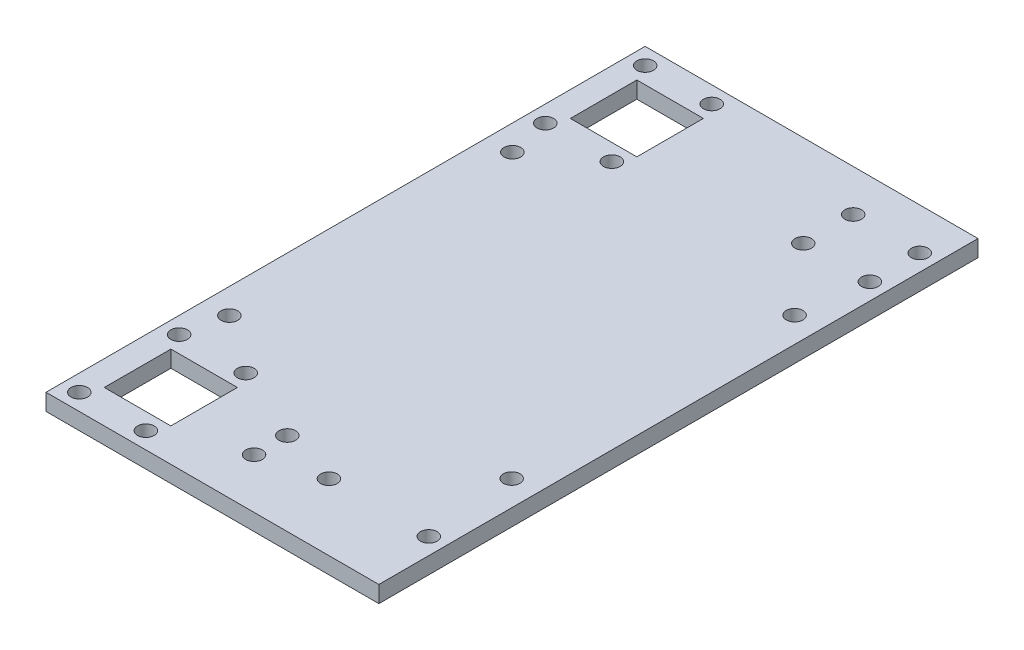
ISO-10303-21;
HEADER;
FILE_DESCRIPTION(('STEP AP214'),'2;1');
FILE_NAME('part.step','',(''),(''),'','','');
FILE_SCHEMA(('AUTOMOTIVE_DESIGN { 1 0 10303 214 1 1 1 1 }'));
ENDSEC;
DATA;
#1=APPLICATION_CONTEXT('core data for automotive mechanical design processes');
#2=APPLICATION_PROTOCOL_DEFINITION('international standard','automotive_design',2000,#1);
#3=PRODUCT_CONTEXT('',#1,'mechanical');
#4=PRODUCT('Part','Part','',(#3));
#5=PRODUCT_RELATED_PRODUCT_CATEGORY('part','',(#4));
#6=PRODUCT_DEFINITION_FORMATION('','',#4);
#7=PRODUCT_DEFINITION_CONTEXT('part definition',#1,'design');
#8=PRODUCT_DEFINITION('design','',#6,#7);
#9=PRODUCT_DEFINITION_SHAPE('','',#8);
#10=(LENGTH_UNIT() NAMED_UNIT(*) SI_UNIT(.MILLI.,.METRE.));
#11=(NAMED_UNIT(*) PLANE_ANGLE_UNIT() SI_UNIT($,.RADIAN.));
#12=(NAMED_UNIT(*) SI_UNIT($,.STERADIAN.) SOLID_ANGLE_UNIT());
#13=UNCERTAINTY_MEASURE_WITH_UNIT(LENGTH_MEASURE(1.E-05),#10,'distance_accuracy_value','');
#14=(GEOMETRIC_REPRESENTATION_CONTEXT(3) GLOBAL_UNCERTAINTY_ASSIGNED_CONTEXT((#13)) GLOBAL_UNIT_ASSIGNED_CONTEXT((#10,
#11,#12)) REPRESENTATION_CONTEXT('',''));
#15=CARTESIAN_POINT('',(0.,0.,0.));
#16=DIRECTION('',(0.,0.,1.));
#17=DIRECTION('',(1.,0.,0.));
#18=AXIS2_PLACEMENT_3D('',#15,#16,#17);
#19=CARTESIAN_POINT('',(0.,6.35,0.));
#20=DIRECTION('',(0.,-1.,0.));
#21=DIRECTION('',(0.,0.,-1.));
#22=AXIS2_PLACEMENT_3D('',#19,#20,#21);
#23=PLANE('',#22);
#24=DIRECTION('',(1.,0.,0.));
#25=VECTOR('',#24,1.);
#26=CARTESIAN_POINT('',(-53.975,6.35,101.599988436039));
#27=LINE('',#26,#25);
#28=CARTESIAN_POINT('',(-53.975,6.35,101.599988436039));
#29=VERTEX_POINT('',#28);
#30=CARTESIAN_POINT('',(-28.575,6.35,101.599988436039));
#31=VERTEX_POINT('',#30);
#32=EDGE_CURVE('E193',#29,#31,#27,.T.);
#33=ORIENTED_EDGE('',*,*,#32,.F.);
#34=DIRECTION('',(-0.00134947967057383,0.,0.999999089451895));
#35=VECTOR('',#34,1.);
#36=CARTESIAN_POINT('',(-53.975,6.35,101.599988436039));
#37=LINE('',#36,#35);
#38=CARTESIAN_POINT('',(-53.9407232163674,6.35,76.2000115639608));
#39=VERTEX_POINT('',#38);
#40=EDGE_CURVE('E423',#39,#29,#37,.T.);
#41=ORIENTED_EDGE('',*,*,#40,.F.);
#42=DIRECTION('',(-1.,0.,0.));
#43=VECTOR('',#42,1.);
#44=CARTESIAN_POINT('',(-28.575,6.35,76.2000115639608));
#45=LINE('',#44,#43);
#46=CARTESIAN_POINT('',(-28.575,6.35,76.2000115639608));
#47=VERTEX_POINT('',#46);
#48=EDGE_CURVE('E419',#47,#39,#45,.T.);
#49=ORIENTED_EDGE('',*,*,#48,.F.);
#50=DIRECTION('',(0.,0.,-1.));
#51=VECTOR('',#50,1.);
#52=CARTESIAN_POINT('',(-28.575,6.35,101.599988436039));
#53=LINE('',#52,#51);
#54=EDGE_CURVE('E424',#31,#47,#53,.T.);
#55=ORIENTED_EDGE('',*,*,#54,.F.);
#56=EDGE_LOOP('',(#33,#41,#49,#55));
#57=FACE_BOUND('',#56,.T.);
#58=DIRECTION('',(0.,0.,-1.));
#59=VECTOR('',#58,1.);
#60=CARTESIAN_POINT('',(63.5,6.35,114.3));
#61=LINE('',#60,#59);
#62=CARTESIAN_POINT('',(63.5,6.35,114.3));
#63=VERTEX_POINT('',#62);
#64=CARTESIAN_POINT('',(63.5,6.35,-114.3));
#65=VERTEX_POINT('',#64);
#66=EDGE_CURVE('E291',#63,#65,#61,.T.);
#67=ORIENTED_EDGE('',*,*,#66,.T.);
#68=DIRECTION('',(-1.,0.,0.));
#69=VECTOR('',#68,1.);
#70=CARTESIAN_POINT('',(-63.5,6.35,-114.3));
#71=LINE('',#70,#69);
#72=CARTESIAN_POINT('',(-63.5,6.35,-114.3));
#73=VERTEX_POINT('',#72);
#74=EDGE_CURVE('E304',#65,#73,#71,.T.);
#75=ORIENTED_EDGE('',*,*,#74,.T.);
#76=DIRECTION('',(0.,0.,1.));
#77=VECTOR('',#76,1.);
#78=CARTESIAN_POINT('',(-63.5,6.35,114.3));
#79=LINE('',#78,#77);
#80=CARTESIAN_POINT('',(-63.5,6.35,114.3));
#81=VERTEX_POINT('',#80);
#82=EDGE_CURVE('E285',#73,#81,#79,.T.);
#83=ORIENTED_EDGE('',*,*,#82,.T.);
#84=DIRECTION('',(1.,0.,0.));
#85=VECTOR('',#84,1.);
#86=CARTESIAN_POINT('',(-63.5,6.35,114.3));
#87=LINE('',#86,#85);
#88=EDGE_CURVE('E298',#81,#63,#87,.T.);
#89=ORIENTED_EDGE('',*,*,#88,.T.);
#90=EDGE_LOOP('',(#67,#75,#83,#89));
#91=FACE_BOUND('',#90,.T.);
#92=CARTESIAN_POINT('',(-57.15,6.35,-107.95));
#93=DIRECTION('',(0.,1.,0.));
#94=DIRECTION('',(0.,0.,1.));
#95=AXIS2_PLACEMENT_3D('',#92,#93,#94);
#96=CIRCLE('',#95,3.175);
#97=CARTESIAN_POINT('',(-57.15,6.35,-104.775));
#98=VERTEX_POINT('',#97);
#99=EDGE_CURVE('E307',#98,#98,#96,.T.);
#100=ORIENTED_EDGE('',*,*,#99,.F.);
#101=EDGE_LOOP('',(#100));
#102=FACE_BOUND('',#101,.T.);
#103=CARTESIAN_POINT('',(-57.15,6.35,-69.85));
#104=DIRECTION('',(0.,1.,0.));
#105=DIRECTION('',(0.,0.,1.));
#106=AXIS2_PLACEMENT_3D('',#103,#104,#105);
#107=CIRCLE('',#106,3.175);
#108=CARTESIAN_POINT('',(-57.15,6.35,-66.675));
#109=VERTEX_POINT('',#108);
#110=EDGE_CURVE('E317',#109,#109,#107,.T.);
#111=ORIENTED_EDGE('',*,*,#110,.F.);
#112=EDGE_LOOP('',(#111));
#113=FACE_BOUND('',#112,.T.);
#114=CARTESIAN_POINT('',(-31.75,6.35,-107.95));
#115=DIRECTION('',(0.,1.,0.));
#116=DIRECTION('',(0.,0.,1.));
#117=AXIS2_PLACEMENT_3D('',#114,#115,#116);
#118=CIRCLE('',#117,3.175);
#119=CARTESIAN_POINT('',(-31.75,6.35,-104.775));
#120=VERTEX_POINT('',#119);
#121=EDGE_CURVE('E337',#120,#120,#118,.T.);
#122=ORIENTED_EDGE('',*,*,#121,.F.);
#123=EDGE_LOOP('',(#122));
#124=FACE_BOUND('',#123,.T.);
#125=CARTESIAN_POINT('',(-31.75,6.35,-69.85));
#126=DIRECTION('',(0.,1.,0.));
#127=DIRECTION('',(0.,0.,1.));
#128=AXIS2_PLACEMENT_3D('',#125,#126,#127);
#129=CIRCLE('',#128,3.175);
#130=CARTESIAN_POINT('',(-31.75,6.35,-66.675));
#131=VERTEX_POINT('',#130);
#132=EDGE_CURVE('E338',#131,#131,#129,.T.);
#133=ORIENTED_EDGE('',*,*,#132,.F.);
#134=EDGE_LOOP('',(#133));
#135=FACE_BOUND('',#134,.T.);
#136=CARTESIAN_POINT('',(-31.75,6.35,69.85));
#137=DIRECTION('',(0.,1.,0.));
#138=DIRECTION('',(0.,0.,-1.));
#139=AXIS2_PLACEMENT_3D('',#136,#137,#138);
#140=CIRCLE('',#139,3.175);
#141=CARTESIAN_POINT('',(-31.75,6.35,66.675));
#142=VERTEX_POINT('',#141);
#143=EDGE_CURVE('E346',#142,#142,#140,.T.);
#144=ORIENTED_EDGE('',*,*,#143,.F.);
#145=EDGE_LOOP('',(#144));
#146=FACE_BOUND('',#145,.T.);
#147=CARTESIAN_POINT('',(-57.15,6.35,69.85));
#148=DIRECTION('',(0.,1.,0.));
#149=DIRECTION('',(0.,0.,-1.));
#150=AXIS2_PLACEMENT_3D('',#147,#148,#149);
#151=CIRCLE('',#150,3.175);
#152=CARTESIAN_POINT('',(-57.15,6.35,66.675));
#153=VERTEX_POINT('',#152);
#154=EDGE_CURVE('E363',#153,#153,#151,.T.);
#155=ORIENTED_EDGE('',*,*,#154,.F.);
#156=EDGE_LOOP('',(#155));
#157=FACE_BOUND('',#156,.T.);
#158=CARTESIAN_POINT('',(-31.75,6.35,107.95));
#159=DIRECTION('',(0.,1.,0.));
#160=DIRECTION('',(0.,0.,-1.));
#161=AXIS2_PLACEMENT_3D('',#158,#159,#160);
#162=CIRCLE('',#161,3.175);
#163=CARTESIAN_POINT('',(-31.75,6.35,104.775));
#164=VERTEX_POINT('',#163);
#165=EDGE_CURVE('E364',#164,#164,#162,.T.);
#166=ORIENTED_EDGE('',*,*,#165,.F.);
#167=EDGE_LOOP('',(#166));
#168=FACE_BOUND('',#167,.T.);
#169=CARTESIAN_POINT('',(-57.15,6.35,107.95));
#170=DIRECTION('',(0.,1.,0.));
#171=DIRECTION('',(0.,0.,-1.));
#172=AXIS2_PLACEMENT_3D('',#169,#170,#171);
#173=CIRCLE('',#172,3.175);
#174=CARTESIAN_POINT('',(-57.15,6.35,104.775));
#175=VERTEX_POINT('',#174);
#176=EDGE_CURVE('E372',#175,#175,#173,.T.);
#177=ORIENTED_EDGE('',*,*,#176,.F.);
#178=EDGE_LOOP('',(#177));
#179=FACE_BOUND('',#178,.T.);
#180=DIRECTION('',(-1.,0.,0.));
#181=VECTOR('',#180,1.);
#182=CARTESIAN_POINT('',(-53.975,6.35,-101.599988436039));
#183=LINE('',#182,#181);
#184=CARTESIAN_POINT('',(-28.575,6.35,-101.599988436039));
#185=VERTEX_POINT('',#184);
#186=CARTESIAN_POINT('',(-53.975,6.35,-101.599988436039));
#187=VERTEX_POINT('',#186);
#188=EDGE_CURVE('E140',#185,#187,#183,.T.);
#189=ORIENTED_EDGE('',*,*,#188,.F.);
#190=DIRECTION('',(0.,0.,-1.));
#191=VECTOR('',#190,1.);
#192=CARTESIAN_POINT('',(-28.575,6.35,-101.599988436039));
#193=LINE('',#192,#191);
#194=CARTESIAN_POINT('',(-28.575,6.35,-76.2000115639608));
#195=VERTEX_POINT('',#194);
#196=EDGE_CURVE('E171',#195,#185,#193,.T.);
#197=ORIENTED_EDGE('',*,*,#196,.F.);
#198=DIRECTION('',(1.,0.,0.));
#199=VECTOR('',#198,1.);
#200=CARTESIAN_POINT('',(-28.575,6.35,-76.2000115639608));
#201=LINE('',#200,#199);
#202=CARTESIAN_POINT('',(-53.9407232163674,6.35,-76.2000115639608));
#203=VERTEX_POINT('',#202);
#204=EDGE_CURVE('E165',#203,#195,#201,.T.);
#205=ORIENTED_EDGE('',*,*,#204,.F.);
#206=DIRECTION('',(0.00134947967057383,0.,0.999999089451895));
#207=VECTOR('',#206,1.);
#208=CARTESIAN_POINT('',(-53.975,6.35,-101.599988436039));
#209=LINE('',#208,#207);
#210=EDGE_CURVE('E150',#187,#203,#209,.T.);
#211=ORIENTED_EDGE('',*,*,#210,.F.);
#212=EDGE_LOOP('',(#189,#197,#205,#211));
#213=FACE_BOUND('',#212,.T.);
#214=CARTESIAN_POINT('',(57.15,6.35,-98.425));
#215=DIRECTION('',(0.,1.,0.));
#216=DIRECTION('',(0.,0.,1.));
#217=AXIS2_PLACEMENT_3D('',#214,#215,#216);
#218=CIRCLE('',#217,3.175);
#219=CARTESIAN_POINT('',(57.15,6.35,-95.25));
#220=VERTEX_POINT('',#219);
#221=EDGE_CURVE('E219',#220,#220,#218,.T.);
#222=ORIENTED_EDGE('',*,*,#221,.F.);
#223=EDGE_LOOP('',(#222));
#224=FACE_BOUND('',#223,.T.);
#225=CARTESIAN_POINT('',(31.75,6.35,-98.425));
#226=DIRECTION('',(0.,1.,0.));
#227=DIRECTION('',(0.,0.,1.));
#228=AXIS2_PLACEMENT_3D('',#225,#226,#227);
#229=CIRCLE('',#228,3.175);
#230=CARTESIAN_POINT('',(31.75,6.35,-95.25));
#231=VERTEX_POINT('',#230);
#232=EDGE_CURVE('E1087',#231,#231,#229,.T.);
#233=ORIENTED_EDGE('',*,*,#232,.F.);
#234=EDGE_LOOP('',(#233));
#235=FACE_BOUND('',#234,.T.);
#236=CARTESIAN_POINT('',(57.15,6.35,-79.375));
#237=DIRECTION('',(0.,1.,0.));
#238=DIRECTION('',(0.,0.,1.));
#239=AXIS2_PLACEMENT_3D('',#236,#237,#238);
#240=CIRCLE('',#239,3.175);
#241=CARTESIAN_POINT('',(57.15,6.35,-76.2));
#242=VERTEX_POINT('',#241);
#243=EDGE_CURVE('E1085',#242,#242,#240,.T.);
#244=ORIENTED_EDGE('',*,*,#243,.F.);
#245=EDGE_LOOP('',(#244));
#246=FACE_BOUND('',#245,.T.);
#247=CARTESIAN_POINT('',(31.75,6.35,-79.375));
#248=DIRECTION('',(0.,1.,0.));
#249=DIRECTION('',(0.,0.,1.));
#250=AXIS2_PLACEMENT_3D('',#247,#248,#249);
#251=CIRCLE('',#250,3.175);
#252=CARTESIAN_POINT('',(31.75,6.35,-76.2));
#253=VERTEX_POINT('',#252);
#254=EDGE_CURVE('E1068',#253,#253,#251,.T.);
#255=ORIENTED_EDGE('',*,*,#254,.F.);
#256=EDGE_LOOP('',(#255));
#257=FACE_BOUND('',#256,.T.);
#258=CARTESIAN_POINT('',(57.15,6.35,88.9));
#259=DIRECTION('',(0.,1.,0.));
#260=DIRECTION('',(0.,0.,1.));
#261=AXIS2_PLACEMENT_3D('',#258,#259,#260);
#262=CIRCLE('',#261,3.175);
#263=CARTESIAN_POINT('',(57.15,6.35,92.075));
#264=VERTEX_POINT('',#263);
#265=EDGE_CURVE('E1066',#264,#264,#262,.T.);
#266=ORIENTED_EDGE('',*,*,#265,.F.);
#267=EDGE_LOOP('',(#266));
#268=FACE_BOUND('',#267,.T.);
#269=CARTESIAN_POINT('',(19.05,6.35,88.9));
#270=DIRECTION('',(0.,1.,0.));
#271=DIRECTION('',(0.,0.,1.));
#272=AXIS2_PLACEMENT_3D('',#269,#270,#271);
#273=CIRCLE('',#272,3.175);
#274=CARTESIAN_POINT('',(19.05,6.35,92.075));
#275=VERTEX_POINT('',#274);
#276=EDGE_CURVE('E1049',#275,#275,#273,.T.);
#277=ORIENTED_EDGE('',*,*,#276,.F.);
#278=EDGE_LOOP('',(#277));
#279=FACE_BOUND('',#278,.T.);
#280=CARTESIAN_POINT('',(-53.848,6.35,53.975));
#281=DIRECTION('',(0.,1.,0.));
#282=DIRECTION('',(0.,0.,1.));
#283=AXIS2_PLACEMENT_3D('',#280,#281,#282);
#284=CIRCLE('',#283,3.175);
#285=CARTESIAN_POINT('',(-53.848,6.35,57.15));
#286=VERTEX_POINT('',#285);
#287=EDGE_CURVE('E1047',#286,#286,#284,.T.);
#288=ORIENTED_EDGE('',*,*,#287,.F.);
#289=EDGE_LOOP('',(#288));
#290=FACE_BOUND('',#289,.T.);
#291=CARTESIAN_POINT('',(-53.848,6.35,-53.975));
#292=DIRECTION('',(0.,1.,0.));
#293=DIRECTION('',(0.,0.,-1.));
#294=AXIS2_PLACEMENT_3D('',#291,#292,#293);
#295=CIRCLE('',#294,3.175);
#296=CARTESIAN_POINT('',(-53.848,6.35,-57.15));
#297=VERTEX_POINT('',#296);
#298=EDGE_CURVE('E1030',#297,#297,#295,.T.);
#299=ORIENTED_EDGE('',*,*,#298,.F.);
#300=EDGE_LOOP('',(#299));
#301=FACE_BOUND('',#300,.T.);
#302=CARTESIAN_POINT('',(53.848,6.35,53.975));
#303=DIRECTION('',(0.,1.,0.));
#304=DIRECTION('',(0.,0.,-1.));
#305=AXIS2_PLACEMENT_3D('',#302,#303,#304);
#306=CIRCLE('',#305,3.175);
#307=CARTESIAN_POINT('',(53.848,6.35,50.8));
#308=VERTEX_POINT('',#307);
#309=EDGE_CURVE('E1028',#308,#308,#306,.T.);
#310=ORIENTED_EDGE('',*,*,#309,.F.);
#311=EDGE_LOOP('',(#310));
#312=FACE_BOUND('',#311,.T.);
#313=CARTESIAN_POINT('',(53.848,6.35,-53.975));
#314=DIRECTION('',(0.,1.,0.));
#315=DIRECTION('',(0.,0.,1.));
#316=AXIS2_PLACEMENT_3D('',#313,#314,#315);
#317=CIRCLE('',#316,3.175);
#318=CARTESIAN_POINT('',(53.848,6.35,-50.8));
#319=VERTEX_POINT('',#318);
#320=EDGE_CURVE('E1011',#319,#319,#317,.T.);
#321=ORIENTED_EDGE('',*,*,#320,.F.);
#322=EDGE_LOOP('',(#321));
#323=FACE_BOUND('',#322,.T.);
#324=CARTESIAN_POINT('',(-3.175,6.35,82.55));
#325=DIRECTION('',(0.,1.,0.));
#326=DIRECTION('',(0.,0.,1.));
#327=AXIS2_PLACEMENT_3D('',#324,#325,#326);
#328=CIRCLE('',#327,3.175);
#329=CARTESIAN_POINT('',(-3.175,6.35,85.725));
#330=VERTEX_POINT('',#329);
#331=EDGE_CURVE('E873',#330,#330,#328,.T.);
#332=ORIENTED_EDGE('',*,*,#331,.F.);
#333=EDGE_LOOP('',(#332));
#334=FACE_BOUND('',#333,.T.);
#335=CARTESIAN_POINT('',(-3.175,6.35,95.25));
#336=DIRECTION('',(0.,1.,0.));
#337=DIRECTION('',(0.,0.,1.));
#338=AXIS2_PLACEMENT_3D('',#335,#336,#337);
#339=CIRCLE('',#338,3.175);
#340=CARTESIAN_POINT('',(-3.175,6.35,98.425));
#341=VERTEX_POINT('',#340);
#342=EDGE_CURVE('E865',#341,#341,#339,.T.);
#343=ORIENTED_EDGE('',*,*,#342,.F.);
#344=EDGE_LOOP('',(#343));
#345=FACE_BOUND('',#344,.T.);
#346=ADVANCED_FACE('F51',(#57,#91,#102,#113,#124,#135,#146,#157,#168,#179,#213,#224,#235,#246,
#257,#268,#279,#290,#301,#312,#323,#334,#345),#23,.F.);
#347=CARTESIAN_POINT('',(0.,0.,0.));
#348=DIRECTION('',(0.,-1.,0.));
#349=DIRECTION('',(0.,0.,-1.));
#350=AXIS2_PLACEMENT_3D('',#347,#348,#349);
#351=PLANE('',#350);
#352=CARTESIAN_POINT('',(-3.175,0.,82.55));
#353=DIRECTION('',(0.,1.,0.));
#354=DIRECTION('',(0.,0.,1.));
#355=AXIS2_PLACEMENT_3D('',#352,#353,#354);
#356=CIRCLE('',#355,3.175);
#357=CARTESIAN_POINT('',(-3.175,0.,85.725));
#358=VERTEX_POINT('',#357);
#359=EDGE_CURVE('E868',#358,#358,#356,.T.);
#360=ORIENTED_EDGE('',*,*,#359,.T.);
#361=EDGE_LOOP('',(#360));
#362=FACE_BOUND('',#361,.T.);
#363=CARTESIAN_POINT('',(53.848,0.,53.975));
#364=DIRECTION('',(0.,1.,0.));
#365=DIRECTION('',(0.,0.,-1.));
#366=AXIS2_PLACEMENT_3D('',#363,#364,#365);
#367=CIRCLE('',#366,3.175);
#368=CARTESIAN_POINT('',(53.848,0.,50.8));
#369=VERTEX_POINT('',#368);
#370=EDGE_CURVE('E1015',#369,#369,#367,.T.);
#371=ORIENTED_EDGE('',*,*,#370,.T.);
#372=EDGE_LOOP('',(#371));
#373=FACE_BOUND('',#372,.T.);
#374=CARTESIAN_POINT('',(-53.848,0.,53.975));
#375=DIRECTION('',(0.,1.,0.));
#376=DIRECTION('',(0.,0.,1.));
#377=AXIS2_PLACEMENT_3D('',#374,#375,#376);
#378=CIRCLE('',#377,3.175);
#379=CARTESIAN_POINT('',(-53.848,0.,57.15));
#380=VERTEX_POINT('',#379);
#381=EDGE_CURVE('E1034',#380,#380,#378,.T.);
#382=ORIENTED_EDGE('',*,*,#381,.T.);
#383=EDGE_LOOP('',(#382));
#384=FACE_BOUND('',#383,.T.);
#385=CARTESIAN_POINT('',(57.15,0.,88.9));
#386=DIRECTION('',(0.,1.,0.));
#387=DIRECTION('',(0.,0.,1.));
#388=AXIS2_PLACEMENT_3D('',#385,#386,#387);
#389=CIRCLE('',#388,3.175);
#390=CARTESIAN_POINT('',(57.15,0.,92.075));
#391=VERTEX_POINT('',#390);
#392=EDGE_CURVE('E1053',#391,#391,#389,.T.);
#393=ORIENTED_EDGE('',*,*,#392,.T.);
#394=EDGE_LOOP('',(#393));
#395=FACE_BOUND('',#394,.T.);
#396=CARTESIAN_POINT('',(57.15,0.,-79.375));
#397=DIRECTION('',(0.,1.,0.));
#398=DIRECTION('',(0.,0.,1.));
#399=AXIS2_PLACEMENT_3D('',#396,#397,#398);
#400=CIRCLE('',#399,3.175);
#401=CARTESIAN_POINT('',(57.15,0.,-76.2));
#402=VERTEX_POINT('',#401);
#403=EDGE_CURVE('E1072',#402,#402,#400,.T.);
#404=ORIENTED_EDGE('',*,*,#403,.T.);
#405=EDGE_LOOP('',(#404));
#406=FACE_BOUND('',#405,.T.);
#407=CARTESIAN_POINT('',(57.15,0.,-98.425));
#408=DIRECTION('',(0.,1.,0.));
#409=DIRECTION('',(0.,0.,1.));
#410=AXIS2_PLACEMENT_3D('',#407,#408,#409);
#411=CIRCLE('',#410,3.175);
#412=CARTESIAN_POINT('',(57.15,0.,-95.25));
#413=VERTEX_POINT('',#412);
#414=EDGE_CURVE('E1091',#413,#413,#411,.T.);
#415=ORIENTED_EDGE('',*,*,#414,.T.);
#416=EDGE_LOOP('',(#415));
#417=FACE_BOUND('',#416,.T.);
#418=CARTESIAN_POINT('',(-31.75,0.,107.95));
#419=DIRECTION('',(0.,1.,0.));
#420=DIRECTION('',(0.,0.,-1.));
#421=AXIS2_PLACEMENT_3D('',#418,#419,#420);
#422=CIRCLE('',#421,3.175);
#423=CARTESIAN_POINT('',(-31.75,0.,104.775));
#424=VERTEX_POINT('',#423);
#425=EDGE_CURVE('E369',#424,#424,#422,.T.);
#426=ORIENTED_EDGE('',*,*,#425,.T.);
#427=EDGE_LOOP('',(#426));
#428=FACE_BOUND('',#427,.T.);
#429=CARTESIAN_POINT('',(-31.75,0.,69.85));
#430=DIRECTION('',(0.,1.,0.));
#431=DIRECTION('',(0.,0.,-1.));
#432=AXIS2_PLACEMENT_3D('',#429,#430,#431);
#433=CIRCLE('',#432,3.175);
#434=CARTESIAN_POINT('',(-31.75,0.,66.675));
#435=VERTEX_POINT('',#434);
#436=EDGE_CURVE('E351',#435,#435,#433,.T.);
#437=ORIENTED_EDGE('',*,*,#436,.T.);
#438=EDGE_LOOP('',(#437));
#439=FACE_BOUND('',#438,.T.);
#440=CARTESIAN_POINT('',(-31.75,0.,-107.95));
#441=DIRECTION('',(0.,1.,0.));
#442=DIRECTION('',(0.,0.,1.));
#443=AXIS2_PLACEMENT_3D('',#440,#441,#442);
#444=CIRCLE('',#443,3.175);
#445=CARTESIAN_POINT('',(-31.75,0.,-104.775));
#446=VERTEX_POINT('',#445);
#447=EDGE_CURVE('E335',#446,#446,#444,.T.);
#448=ORIENTED_EDGE('',*,*,#447,.T.);
#449=EDGE_LOOP('',(#448));
#450=FACE_BOUND('',#449,.T.);
#451=CARTESIAN_POINT('',(-57.15,0.,-107.95));
#452=DIRECTION('',(0.,1.,0.));
#453=DIRECTION('',(0.,0.,1.));
#454=AXIS2_PLACEMENT_3D('',#451,#452,#453);
#455=CIRCLE('',#454,3.175);
#456=CARTESIAN_POINT('',(-57.15,0.,-104.775));
#457=VERTEX_POINT('',#456);
#458=EDGE_CURVE('E310',#457,#457,#455,.T.);
#459=ORIENTED_EDGE('',*,*,#458,.T.);
#460=EDGE_LOOP('',(#459));
#461=FACE_BOUND('',#460,.T.);
#462=DIRECTION('',(0.,0.,-1.));
#463=VECTOR('',#462,1.);
#464=CARTESIAN_POINT('',(63.5,0.,114.3));
#465=LINE('',#464,#463);
#466=CARTESIAN_POINT('',(63.5,0.,114.3));
#467=VERTEX_POINT('',#466);
#468=CARTESIAN_POINT('',(63.5,0.,-114.3));
#469=VERTEX_POINT('',#468);
#470=EDGE_CURVE('E281',#467,#469,#465,.T.);
#471=ORIENTED_EDGE('',*,*,#470,.F.);
#472=DIRECTION('',(1.,0.,0.));
#473=VECTOR('',#472,1.);
#474=CARTESIAN_POINT('',(-63.5,0.,114.3));
#475=LINE('',#474,#473);
#476=CARTESIAN_POINT('',(-63.5,0.,114.3));
#477=VERTEX_POINT('',#476);
#478=EDGE_CURVE('E289',#477,#467,#475,.T.);
#479=ORIENTED_EDGE('',*,*,#478,.F.);
#480=DIRECTION('',(0.,0.,1.));
#481=VECTOR('',#480,1.);
#482=CARTESIAN_POINT('',(-63.5,0.,114.3));
#483=LINE('',#482,#481);
#484=CARTESIAN_POINT('',(-63.5,0.,-114.3));
#485=VERTEX_POINT('',#484);
#486=EDGE_CURVE('E280',#485,#477,#483,.T.);
#487=ORIENTED_EDGE('',*,*,#486,.F.);
#488=DIRECTION('',(-1.,0.,0.));
#489=VECTOR('',#488,1.);
#490=CARTESIAN_POINT('',(-63.5,0.,-114.3));
#491=LINE('',#490,#489);
#492=EDGE_CURVE('E272',#469,#485,#491,.T.);
#493=ORIENTED_EDGE('',*,*,#492,.F.);
#494=EDGE_LOOP('',(#471,#479,#487,#493));
#495=FACE_BOUND('',#494,.T.);
#496=CARTESIAN_POINT('',(-57.15,0.,-69.85));
#497=DIRECTION('',(0.,1.,0.));
#498=DIRECTION('',(0.,0.,1.));
#499=AXIS2_PLACEMENT_3D('',#496,#497,#498);
#500=CIRCLE('',#499,3.175);
#501=CARTESIAN_POINT('',(-57.15,0.,-66.675));
#502=VERTEX_POINT('',#501);
#503=EDGE_CURVE('E321',#502,#502,#500,.T.);
#504=ORIENTED_EDGE('',*,*,#503,.T.);
#505=EDGE_LOOP('',(#504));
#506=FACE_BOUND('',#505,.T.);
#507=CARTESIAN_POINT('',(-31.75,0.,-69.85));
#508=DIRECTION('',(0.,1.,0.));
#509=DIRECTION('',(0.,0.,1.));
#510=AXIS2_PLACEMENT_3D('',#507,#508,#509);
#511=CIRCLE('',#510,3.175);
#512=CARTESIAN_POINT('',(-31.75,0.,-66.675));
#513=VERTEX_POINT('',#512);
#514=EDGE_CURVE('E343',#513,#513,#511,.T.);
#515=ORIENTED_EDGE('',*,*,#514,.T.);
#516=EDGE_LOOP('',(#515));
#517=FACE_BOUND('',#516,.T.);
#518=CARTESIAN_POINT('',(-57.15,0.,69.85));
#519=DIRECTION('',(0.,1.,0.));
#520=DIRECTION('',(0.,0.,-1.));
#521=AXIS2_PLACEMENT_3D('',#518,#519,#520);
#522=CIRCLE('',#521,3.175);
#523=CARTESIAN_POINT('',(-57.15,0.,66.675));
#524=VERTEX_POINT('',#523);
#525=EDGE_CURVE('E361',#524,#524,#522,.T.);
#526=ORIENTED_EDGE('',*,*,#525,.T.);
#527=EDGE_LOOP('',(#526));
#528=FACE_BOUND('',#527,.T.);
#529=CARTESIAN_POINT('',(-57.15,0.,107.95));
#530=DIRECTION('',(0.,1.,0.));
#531=DIRECTION('',(0.,0.,-1.));
#532=AXIS2_PLACEMENT_3D('',#529,#530,#531);
#533=CIRCLE('',#532,3.175);
#534=CARTESIAN_POINT('',(-57.15,0.,104.775));
#535=VERTEX_POINT('',#534);
#536=EDGE_CURVE('E377',#535,#535,#533,.T.);
#537=ORIENTED_EDGE('',*,*,#536,.T.);
#538=EDGE_LOOP('',(#537));
#539=FACE_BOUND('',#538,.T.);
#540=DIRECTION('',(-0.00134947967057383,0.,0.999999089451895));
#541=VECTOR('',#540,1.);
#542=CARTESIAN_POINT('',(-53.975,0.,101.599988436039));
#543=LINE('',#542,#541);
#544=CARTESIAN_POINT('',(-53.9407232163674,0.,76.2000115639608));
#545=VERTEX_POINT('',#544);
#546=CARTESIAN_POINT('',(-53.975,0.,101.599988436039));
#547=VERTEX_POINT('',#546);
#548=EDGE_CURVE('E412',#545,#547,#543,.T.);
#549=ORIENTED_EDGE('',*,*,#548,.T.);
#550=DIRECTION('',(1.,0.,0.));
#551=VECTOR('',#550,1.);
#552=CARTESIAN_POINT('',(-53.975,0.,101.599988436039));
#553=LINE('',#552,#551);
#554=CARTESIAN_POINT('',(-28.575,0.,101.599988436039));
#555=VERTEX_POINT('',#554);
#556=EDGE_CURVE('E160',#547,#555,#553,.T.);
#557=ORIENTED_EDGE('',*,*,#556,.T.);
#558=DIRECTION('',(0.,0.,-1.));
#559=VECTOR('',#558,1.);
#560=CARTESIAN_POINT('',(-28.575,0.,101.599988436039));
#561=LINE('',#560,#559);
#562=CARTESIAN_POINT('',(-28.575,0.,76.2000115639608));
#563=VERTEX_POINT('',#562);
#564=EDGE_CURVE('E401',#555,#563,#561,.T.);
#565=ORIENTED_EDGE('',*,*,#564,.T.);
#566=DIRECTION('',(-1.,0.,0.));
#567=VECTOR('',#566,1.);
#568=CARTESIAN_POINT('',(-28.575,0.,76.2000115639608));
#569=LINE('',#568,#567);
#570=EDGE_CURVE('E406',#563,#545,#569,.T.);
#571=ORIENTED_EDGE('',*,*,#570,.T.);
#572=EDGE_LOOP('',(#549,#557,#565,#571));
#573=FACE_BOUND('',#572,.T.);
#574=DIRECTION('',(0.,0.,-1.));
#575=VECTOR('',#574,1.);
#576=CARTESIAN_POINT('',(-28.575,0.,-101.599988436039));
#577=LINE('',#576,#575);
#578=CARTESIAN_POINT('',(-28.575,0.,-76.2000115639608));
#579=VERTEX_POINT('',#578);
#580=CARTESIAN_POINT('',(-28.575,0.,-101.599988436039));
#581=VERTEX_POINT('',#580);
#582=EDGE_CURVE('E151',#579,#581,#577,.T.);
#583=ORIENTED_EDGE('',*,*,#582,.T.);
#584=DIRECTION('',(-1.,0.,0.));
#585=VECTOR('',#584,1.);
#586=CARTESIAN_POINT('',(-53.975,0.,-101.599988436039));
#587=LINE('',#586,#585);
#588=CARTESIAN_POINT('',(-53.975,0.,-101.599988436039));
#589=VERTEX_POINT('',#588);
#590=EDGE_CURVE('E74',#581,#589,#587,.T.);
#591=ORIENTED_EDGE('',*,*,#590,.T.);
#592=DIRECTION('',(0.00134947967057383,0.,0.999999089451895));
#593=VECTOR('',#592,1.);
#594=CARTESIAN_POINT('',(-53.975,0.,-101.599988436039));
#595=LINE('',#594,#593);
#596=CARTESIAN_POINT('',(-53.9407232163674,0.,-76.2000115639608));
#597=VERTEX_POINT('',#596);
#598=EDGE_CURVE('E158',#589,#597,#595,.T.);
#599=ORIENTED_EDGE('',*,*,#598,.T.);
#600=DIRECTION('',(1.,0.,0.));
#601=VECTOR('',#600,1.);
#602=CARTESIAN_POINT('',(-28.575,0.,-76.2000115639608));
#603=LINE('',#602,#601);
#604=EDGE_CURVE('E207',#597,#579,#603,.T.);
#605=ORIENTED_EDGE('',*,*,#604,.T.);
#606=EDGE_LOOP('',(#583,#591,#599,#605));
#607=FACE_BOUND('',#606,.T.);
#608=CARTESIAN_POINT('',(31.75,0.,-98.425));
#609=DIRECTION('',(0.,1.,0.));
#610=DIRECTION('',(0.,0.,1.));
#611=AXIS2_PLACEMENT_3D('',#608,#609,#610);
#612=CIRCLE('',#611,3.175);
#613=CARTESIAN_POINT('',(31.75,0.,-95.25));
#614=VERTEX_POINT('',#613);
#615=EDGE_CURVE('E1092',#614,#614,#612,.T.);
#616=ORIENTED_EDGE('',*,*,#615,.T.);
#617=EDGE_LOOP('',(#616));
#618=FACE_BOUND('',#617,.T.);
#619=CARTESIAN_POINT('',(31.75,0.,-79.375));
#620=DIRECTION('',(0.,1.,0.));
#621=DIRECTION('',(0.,0.,1.));
#622=AXIS2_PLACEMENT_3D('',#619,#620,#621);
#623=CIRCLE('',#622,3.175);
#624=CARTESIAN_POINT('',(31.75,0.,-76.2));
#625=VERTEX_POINT('',#624);
#626=EDGE_CURVE('E1073',#625,#625,#623,.T.);
#627=ORIENTED_EDGE('',*,*,#626,.T.);
#628=EDGE_LOOP('',(#627));
#629=FACE_BOUND('',#628,.T.);
#630=CARTESIAN_POINT('',(19.05,0.,88.9));
#631=DIRECTION('',(0.,1.,0.));
#632=DIRECTION('',(0.,0.,1.));
#633=AXIS2_PLACEMENT_3D('',#630,#631,#632);
#634=CIRCLE('',#633,3.175);
#635=CARTESIAN_POINT('',(19.05,0.,92.075));
#636=VERTEX_POINT('',#635);
#637=EDGE_CURVE('E1054',#636,#636,#634,.T.);
#638=ORIENTED_EDGE('',*,*,#637,.T.);
#639=EDGE_LOOP('',(#638));
#640=FACE_BOUND('',#639,.T.);
#641=CARTESIAN_POINT('',(-53.848,0.,-53.975));
#642=DIRECTION('',(0.,1.,0.));
#643=DIRECTION('',(0.,0.,-1.));
#644=AXIS2_PLACEMENT_3D('',#641,#642,#643);
#645=CIRCLE('',#644,3.175);
#646=CARTESIAN_POINT('',(-53.848,0.,-57.15));
#647=VERTEX_POINT('',#646);
#648=EDGE_CURVE('E1035',#647,#647,#645,.T.);
#649=ORIENTED_EDGE('',*,*,#648,.T.);
#650=EDGE_LOOP('',(#649));
#651=FACE_BOUND('',#650,.T.);
#652=CARTESIAN_POINT('',(53.848,0.,-53.975));
#653=DIRECTION('',(0.,1.,0.));
#654=DIRECTION('',(0.,0.,1.));
#655=AXIS2_PLACEMENT_3D('',#652,#653,#654);
#656=CIRCLE('',#655,3.175);
#657=CARTESIAN_POINT('',(53.848,0.,-50.8));
#658=VERTEX_POINT('',#657);
#659=EDGE_CURVE('E1016',#658,#658,#656,.T.);
#660=ORIENTED_EDGE('',*,*,#659,.T.);
#661=EDGE_LOOP('',(#660));
#662=FACE_BOUND('',#661,.T.);
#663=CARTESIAN_POINT('',(-3.175,0.,95.25));
#664=DIRECTION('',(0.,1.,0.));
#665=DIRECTION('',(0.,0.,1.));
#666=AXIS2_PLACEMENT_3D('',#663,#664,#665);
#667=CIRCLE('',#666,3.175);
#668=CARTESIAN_POINT('',(-3.175,0.,98.425));
#669=VERTEX_POINT('',#668);
#670=EDGE_CURVE('E594',#669,#669,#667,.T.);
#671=ORIENTED_EDGE('',*,*,#670,.T.);
#672=EDGE_LOOP('',(#671));
#673=FACE_BOUND('',#672,.T.);
#674=ADVANCED_FACE('F225',(#362,#373,#384,#395,#406,#417,#428,#439,#450,#461,#495,#506,#517,
#528,#539,#573,#607,#618,#629,#640,#651,#662,#673),#351,.T.);
#675=CARTESIAN_POINT('',(63.5,6.35,114.3));
#676=DIRECTION('',(-1.,0.,0.));
#677=DIRECTION('',(0.,0.,1.));
#678=AXIS2_PLACEMENT_3D('',#675,#676,#677);
#679=PLANE('',#678);
#680=ORIENTED_EDGE('',*,*,#470,.T.);
#681=DIRECTION('',(0.,-1.,0.));
#682=VECTOR('',#681,1.);
#683=CARTESIAN_POINT('',(63.5,6.35,-114.3));
#684=LINE('',#683,#682);
#685=EDGE_CURVE('E12',#65,#469,#684,.T.);
#686=ORIENTED_EDGE('',*,*,#685,.F.);
#687=ORIENTED_EDGE('',*,*,#66,.F.);
#688=DIRECTION('',(0.,-1.,0.));
#689=VECTOR('',#688,1.);
#690=CARTESIAN_POINT('',(63.5,6.35,114.3));
#691=LINE('',#690,#689);
#692=EDGE_CURVE('E295',#63,#467,#691,.T.);
#693=ORIENTED_EDGE('',*,*,#692,.T.);
#694=EDGE_LOOP('',(#680,#686,#687,#693));
#695=FACE_BOUND('',#694,.T.);
#696=ADVANCED_FACE('F53',(#695),#679,.F.);
#697=CARTESIAN_POINT('',(-63.5,6.35,-114.3));
#698=DIRECTION('',(0.,0.,1.));
#699=DIRECTION('',(1.,0.,0.));
#700=AXIS2_PLACEMENT_3D('',#697,#698,#699);
#701=PLANE('',#700);
#702=ORIENTED_EDGE('',*,*,#492,.T.);
#703=DIRECTION('',(0.,-1.,0.));
#704=VECTOR('',#703,1.);
#705=CARTESIAN_POINT('',(-63.5,6.35,-114.3));
#706=LINE('',#705,#704);
#707=EDGE_CURVE('E59',#73,#485,#706,.T.);
#708=ORIENTED_EDGE('',*,*,#707,.F.);
#709=ORIENTED_EDGE('',*,*,#74,.F.);
#710=ORIENTED_EDGE('',*,*,#685,.T.);
#711=EDGE_LOOP('',(#702,#708,#709,#710));
#712=FACE_BOUND('',#711,.T.);
#713=ADVANCED_FACE('F264',(#712),#701,.F.);
#714=CARTESIAN_POINT('',(-63.5,6.35,114.3));
#715=DIRECTION('',(1.,0.,0.));
#716=DIRECTION('',(0.,0.,-1.));
#717=AXIS2_PLACEMENT_3D('',#714,#715,#716);
#718=PLANE('',#717);
#719=ORIENTED_EDGE('',*,*,#486,.T.);
#720=DIRECTION('',(0.,-1.,0.));
#721=VECTOR('',#720,1.);
#722=CARTESIAN_POINT('',(-63.5,6.35,114.3));
#723=LINE('',#722,#721);
#724=EDGE_CURVE('E286',#81,#477,#723,.T.);
#725=ORIENTED_EDGE('',*,*,#724,.F.);
#726=ORIENTED_EDGE('',*,*,#82,.F.);
#727=ORIENTED_EDGE('',*,*,#707,.T.);
#728=EDGE_LOOP('',(#719,#725,#726,#727));
#729=FACE_BOUND('',#728,.T.);
#730=ADVANCED_FACE('F261',(#729),#718,.F.);
#731=CARTESIAN_POINT('',(-63.5,6.35,114.3));
#732=DIRECTION('',(0.,0.,-1.));
#733=DIRECTION('',(-1.,0.,0.));
#734=AXIS2_PLACEMENT_3D('',#731,#732,#733);
#735=PLANE('',#734);
#736=ORIENTED_EDGE('',*,*,#478,.T.);
#737=ORIENTED_EDGE('',*,*,#692,.F.);
#738=ORIENTED_EDGE('',*,*,#88,.F.);
#739=ORIENTED_EDGE('',*,*,#724,.T.);
#740=EDGE_LOOP('',(#736,#737,#738,#739));
#741=FACE_BOUND('',#740,.T.);
#742=ADVANCED_FACE('F259',(#741),#735,.F.);
#743=CARTESIAN_POINT('',(-57.15,6.35,-107.95));
#744=DIRECTION('',(0.,-1.,0.));
#745=DIRECTION('',(0.,0.,-1.));
#746=AXIS2_PLACEMENT_3D('',#743,#744,#745);
#747=CYLINDRICAL_SURFACE('',#746,3.175);
#748=ORIENTED_EDGE('',*,*,#99,.T.);
#749=EDGE_LOOP('',(#748));
#750=FACE_BOUND('',#749,.T.);
#751=ORIENTED_EDGE('',*,*,#458,.F.);
#752=EDGE_LOOP('',(#751));
#753=FACE_BOUND('',#752,.T.);
#754=ADVANCED_FACE('F256',(#750,#753),#747,.F.);
#755=CARTESIAN_POINT('',(-57.15,6.35,-69.85));
#756=DIRECTION('',(0.,-1.,0.));
#757=DIRECTION('',(0.,0.,-1.));
#758=AXIS2_PLACEMENT_3D('',#755,#756,#757);
#759=CYLINDRICAL_SURFACE('',#758,3.175);
#760=ORIENTED_EDGE('',*,*,#110,.T.);
#761=EDGE_LOOP('',(#760));
#762=FACE_BOUND('',#761,.T.);
#763=ORIENTED_EDGE('',*,*,#503,.F.);
#764=EDGE_LOOP('',(#763));
#765=FACE_BOUND('',#764,.T.);
#766=ADVANCED_FACE('F487',(#762,#765),#759,.F.);
#767=CARTESIAN_POINT('',(-31.75,6.35,-107.95));
#768=DIRECTION('',(0.,-1.,0.));
#769=DIRECTION('',(0.,0.,-1.));
#770=AXIS2_PLACEMENT_3D('',#767,#768,#769);
#771=CYLINDRICAL_SURFACE('',#770,3.175);
#772=ORIENTED_EDGE('',*,*,#121,.T.);
#773=EDGE_LOOP('',(#772));
#774=FACE_BOUND('',#773,.T.);
#775=ORIENTED_EDGE('',*,*,#447,.F.);
#776=EDGE_LOOP('',(#775));
#777=FACE_BOUND('',#776,.T.);
#778=ADVANCED_FACE('F484',(#774,#777),#771,.F.);
#779=CARTESIAN_POINT('',(-31.75,6.35,-69.85));
#780=DIRECTION('',(0.,-1.,0.));
#781=DIRECTION('',(0.,0.,-1.));
#782=AXIS2_PLACEMENT_3D('',#779,#780,#781);
#783=CYLINDRICAL_SURFACE('',#782,3.175);
#784=ORIENTED_EDGE('',*,*,#132,.T.);
#785=EDGE_LOOP('',(#784));
#786=FACE_BOUND('',#785,.T.);
#787=ORIENTED_EDGE('',*,*,#514,.F.);
#788=EDGE_LOOP('',(#787));
#789=FACE_BOUND('',#788,.T.);
#790=ADVANCED_FACE('F480',(#786,#789),#783,.F.);
#791=CARTESIAN_POINT('',(-31.75,6.35,69.85));
#792=DIRECTION('',(0.,-1.,0.));
#793=DIRECTION('',(0.,0.,-1.));
#794=AXIS2_PLACEMENT_3D('',#791,#792,#793);
#795=CYLINDRICAL_SURFACE('',#794,3.175);
#796=ORIENTED_EDGE('',*,*,#143,.T.);
#797=EDGE_LOOP('',(#796));
#798=FACE_BOUND('',#797,.T.);
#799=ORIENTED_EDGE('',*,*,#436,.F.);
#800=EDGE_LOOP('',(#799));
#801=FACE_BOUND('',#800,.T.);
#802=ADVANCED_FACE('F476',(#798,#801),#795,.F.);
#803=CARTESIAN_POINT('',(-57.15,6.35,69.85));
#804=DIRECTION('',(0.,-1.,0.));
#805=DIRECTION('',(0.,0.,-1.));
#806=AXIS2_PLACEMENT_3D('',#803,#804,#805);
#807=CYLINDRICAL_SURFACE('',#806,3.175);
#808=ORIENTED_EDGE('',*,*,#154,.T.);
#809=EDGE_LOOP('',(#808));
#810=FACE_BOUND('',#809,.T.);
#811=ORIENTED_EDGE('',*,*,#525,.F.);
#812=EDGE_LOOP('',(#811));
#813=FACE_BOUND('',#812,.T.);
#814=ADVANCED_FACE('F472',(#810,#813),#807,.F.);
#815=CARTESIAN_POINT('',(-31.75,6.35,107.95));
#816=DIRECTION('',(0.,-1.,0.));
#817=DIRECTION('',(0.,0.,-1.));
#818=AXIS2_PLACEMENT_3D('',#815,#816,#817);
#819=CYLINDRICAL_SURFACE('',#818,3.175);
#820=ORIENTED_EDGE('',*,*,#165,.T.);
#821=EDGE_LOOP('',(#820));
#822=FACE_BOUND('',#821,.T.);
#823=ORIENTED_EDGE('',*,*,#425,.F.);
#824=EDGE_LOOP('',(#823));
#825=FACE_BOUND('',#824,.T.);
#826=ADVANCED_FACE('F465',(#822,#825),#819,.F.);
#827=CARTESIAN_POINT('',(-57.15,6.35,107.95));
#828=DIRECTION('',(0.,-1.,0.));
#829=DIRECTION('',(0.,0.,-1.));
#830=AXIS2_PLACEMENT_3D('',#827,#828,#829);
#831=CYLINDRICAL_SURFACE('',#830,3.175);
#832=ORIENTED_EDGE('',*,*,#176,.T.);
#833=EDGE_LOOP('',(#832));
#834=FACE_BOUND('',#833,.T.);
#835=ORIENTED_EDGE('',*,*,#536,.F.);
#836=EDGE_LOOP('',(#835));
#837=FACE_BOUND('',#836,.T.);
#838=ADVANCED_FACE('F459',(#834,#837),#831,.F.);
#839=CARTESIAN_POINT('',(-53.975,6.35,101.599988436039));
#840=DIRECTION('',(0.,0.,-1.));
#841=DIRECTION('',(-1.,0.,0.));
#842=AXIS2_PLACEMENT_3D('',#839,#840,#841);
#843=PLANE('',#842);
#844=ORIENTED_EDGE('',*,*,#556,.F.);
#845=DIRECTION('',(0.,-1.,0.));
#846=VECTOR('',#845,1.);
#847=CARTESIAN_POINT('',(-53.975,6.35,101.599988436039));
#848=LINE('',#847,#846);
#849=EDGE_CURVE('E427',#29,#547,#848,.T.);
#850=ORIENTED_EDGE('',*,*,#849,.F.);
#851=ORIENTED_EDGE('',*,*,#32,.T.);
#852=DIRECTION('',(0.,-1.,0.));
#853=VECTOR('',#852,1.);
#854=CARTESIAN_POINT('',(-28.575,6.35,101.599988436039));
#855=LINE('',#854,#853);
#856=EDGE_CURVE('E387',#31,#555,#855,.T.);
#857=ORIENTED_EDGE('',*,*,#856,.T.);
#858=EDGE_LOOP('',(#844,#850,#851,#857));
#859=FACE_BOUND('',#858,.T.);
#860=ADVANCED_FACE('F458',(#859),#843,.T.);
#861=CARTESIAN_POINT('',(-28.575,6.35,101.599988436039));
#862=DIRECTION('',(-1.,0.,0.));
#863=DIRECTION('',(0.,0.,1.));
#864=AXIS2_PLACEMENT_3D('',#861,#862,#863);
#865=PLANE('',#864);
#866=ORIENTED_EDGE('',*,*,#564,.F.);
#867=ORIENTED_EDGE('',*,*,#856,.F.);
#868=ORIENTED_EDGE('',*,*,#54,.T.);
#869=DIRECTION('',(0.,-1.,0.));
#870=VECTOR('',#869,1.);
#871=CARTESIAN_POINT('',(-28.575,6.35,76.2000115639608));
#872=LINE('',#871,#870);
#873=EDGE_CURVE('E392',#47,#563,#872,.T.);
#874=ORIENTED_EDGE('',*,*,#873,.T.);
#875=EDGE_LOOP('',(#866,#867,#868,#874));
#876=FACE_BOUND('',#875,.T.);
#877=ADVANCED_FACE('F449',(#876),#865,.T.);
#878=CARTESIAN_POINT('',(-28.575,6.35,76.2000115639608));
#879=DIRECTION('',(0.,0.,1.));
#880=DIRECTION('',(1.,0.,0.));
#881=AXIS2_PLACEMENT_3D('',#878,#879,#880);
#882=PLANE('',#881);
#883=ORIENTED_EDGE('',*,*,#570,.F.);
#884=ORIENTED_EDGE('',*,*,#873,.F.);
#885=ORIENTED_EDGE('',*,*,#48,.T.);
#886=DIRECTION('',(0.,-1.,0.));
#887=VECTOR('',#886,1.);
#888=CARTESIAN_POINT('',(-53.9407232163674,6.35,76.2000115639608));
#889=LINE('',#888,#887);
#890=EDGE_CURVE('E434',#39,#545,#889,.T.);
#891=ORIENTED_EDGE('',*,*,#890,.T.);
#892=EDGE_LOOP('',(#883,#884,#885,#891));
#893=FACE_BOUND('',#892,.T.);
#894=ADVANCED_FACE('F454',(#893),#882,.T.);
#895=CARTESIAN_POINT('',(-53.975,6.35,101.599988436039));
#896=DIRECTION('',(0.999999089451895,0.,0.00134947967057383));
#897=DIRECTION('',(0.00134947967057383,0.,-0.999999089451895));
#898=AXIS2_PLACEMENT_3D('',#895,#896,#897);
#899=PLANE('',#898);
#900=ORIENTED_EDGE('',*,*,#548,.F.);
#901=ORIENTED_EDGE('',*,*,#890,.F.);
#902=ORIENTED_EDGE('',*,*,#40,.T.);
#903=ORIENTED_EDGE('',*,*,#849,.T.);
#904=EDGE_LOOP('',(#900,#901,#902,#903));
#905=FACE_BOUND('',#904,.T.);
#906=ADVANCED_FACE('F724',(#905),#899,.T.);
#907=CARTESIAN_POINT('',(-53.975,6.35,-101.599988436039));
#908=DIRECTION('',(0.,0.,1.));
#909=DIRECTION('',(1.,0.,0.));
#910=AXIS2_PLACEMENT_3D('',#907,#908,#909);
#911=PLANE('',#910);
#912=ORIENTED_EDGE('',*,*,#590,.F.);
#913=DIRECTION('',(0.,-1.,0.));
#914=VECTOR('',#913,1.);
#915=CARTESIAN_POINT('',(-28.575,6.35,-101.599988436039));
#916=LINE('',#915,#914);
#917=EDGE_CURVE('E145',#185,#581,#916,.T.);
#918=ORIENTED_EDGE('',*,*,#917,.F.);
#919=ORIENTED_EDGE('',*,*,#188,.T.);
#920=DIRECTION('',(0.,-1.,0.));
#921=VECTOR('',#920,1.);
#922=CARTESIAN_POINT('',(-53.975,6.35,-101.599988436039));
#923=LINE('',#922,#921);
#924=EDGE_CURVE('E144',#187,#589,#923,.T.);
#925=ORIENTED_EDGE('',*,*,#924,.T.);
#926=EDGE_LOOP('',(#912,#918,#919,#925));
#927=FACE_BOUND('',#926,.T.);
#928=ADVANCED_FACE('F143',(#927),#911,.T.);
#929=CARTESIAN_POINT('',(-53.975,6.35,-101.599988436039));
#930=DIRECTION('',(0.999999089451895,0.,-0.00134947967057383));
#931=DIRECTION('',(-0.00134947967057383,0.,-0.999999089451895));
#932=AXIS2_PLACEMENT_3D('',#929,#930,#931);
#933=PLANE('',#932);
#934=ORIENTED_EDGE('',*,*,#598,.F.);
#935=ORIENTED_EDGE('',*,*,#924,.F.);
#936=ORIENTED_EDGE('',*,*,#210,.T.);
#937=DIRECTION('',(0.,-1.,0.));
#938=VECTOR('',#937,1.);
#939=CARTESIAN_POINT('',(-53.9407232163674,6.35,-76.2000115639608));
#940=LINE('',#939,#938);
#941=EDGE_CURVE('E161',#203,#597,#940,.T.);
#942=ORIENTED_EDGE('',*,*,#941,.T.);
#943=EDGE_LOOP('',(#934,#935,#936,#942));
#944=FACE_BOUND('',#943,.T.);
#945=ADVANCED_FACE('F155',(#944),#933,.T.);
#946=CARTESIAN_POINT('',(-28.575,6.35,-76.2000115639608));
#947=DIRECTION('',(0.,0.,-1.));
#948=DIRECTION('',(-1.,0.,0.));
#949=AXIS2_PLACEMENT_3D('',#946,#947,#948);
#950=PLANE('',#949);
#951=ORIENTED_EDGE('',*,*,#604,.F.);
#952=ORIENTED_EDGE('',*,*,#941,.F.);
#953=ORIENTED_EDGE('',*,*,#204,.T.);
#954=DIRECTION('',(0.,-1.,0.));
#955=VECTOR('',#954,1.);
#956=CARTESIAN_POINT('',(-28.575,6.35,-76.2000115639608));
#957=LINE('',#956,#955);
#958=EDGE_CURVE('E66',#195,#579,#957,.T.);
#959=ORIENTED_EDGE('',*,*,#958,.T.);
#960=EDGE_LOOP('',(#951,#952,#953,#959));
#961=FACE_BOUND('',#960,.T.);
#962=ADVANCED_FACE('F229',(#961),#950,.T.);
#963=CARTESIAN_POINT('',(-28.575,6.35,-101.599988436039));
#964=DIRECTION('',(-1.,0.,0.));
#965=DIRECTION('',(0.,0.,1.));
#966=AXIS2_PLACEMENT_3D('',#963,#964,#965);
#967=PLANE('',#966);
#968=ORIENTED_EDGE('',*,*,#582,.F.);
#969=ORIENTED_EDGE('',*,*,#958,.F.);
#970=ORIENTED_EDGE('',*,*,#196,.T.);
#971=ORIENTED_EDGE('',*,*,#917,.T.);
#972=EDGE_LOOP('',(#968,#969,#970,#971));
#973=FACE_BOUND('',#972,.T.);
#974=ADVANCED_FACE('F232',(#973),#967,.T.);
#975=CARTESIAN_POINT('',(57.15,6.35,-98.425));
#976=DIRECTION('',(0.,-1.,0.));
#977=DIRECTION('',(0.,0.,-1.));
#978=AXIS2_PLACEMENT_3D('',#975,#976,#977);
#979=CYLINDRICAL_SURFACE('',#978,3.175);
#980=ORIENTED_EDGE('',*,*,#221,.T.);
#981=EDGE_LOOP('',(#980));
#982=FACE_BOUND('',#981,.T.);
#983=ORIENTED_EDGE('',*,*,#414,.F.);
#984=EDGE_LOOP('',(#983));
#985=FACE_BOUND('',#984,.T.);
#986=ADVANCED_FACE('F235',(#982,#985),#979,.F.);
#987=CARTESIAN_POINT('',(31.75,6.35,-98.425));
#988=DIRECTION('',(0.,-1.,0.));
#989=DIRECTION('',(0.,0.,-1.));
#990=AXIS2_PLACEMENT_3D('',#987,#988,#989);
#991=CYLINDRICAL_SURFACE('',#990,3.175);
#992=ORIENTED_EDGE('',*,*,#232,.T.);
#993=EDGE_LOOP('',(#992));
#994=FACE_BOUND('',#993,.T.);
#995=ORIENTED_EDGE('',*,*,#615,.F.);
#996=EDGE_LOOP('',(#995));
#997=FACE_BOUND('',#996,.T.);
#998=ADVANCED_FACE('F241',(#994,#997),#991,.F.);
#999=CARTESIAN_POINT('',(57.15,6.35,-79.375));
#1000=DIRECTION('',(0.,-1.,0.));
#1001=DIRECTION('',(0.,0.,-1.));
#1002=AXIS2_PLACEMENT_3D('',#999,#1000,#1001);
#1003=CYLINDRICAL_SURFACE('',#1002,3.175);
#1004=ORIENTED_EDGE('',*,*,#243,.T.);
#1005=EDGE_LOOP('',(#1004));
#1006=FACE_BOUND('',#1005,.T.);
#1007=ORIENTED_EDGE('',*,*,#403,.F.);
#1008=EDGE_LOOP('',(#1007));
#1009=FACE_BOUND('',#1008,.T.);
#1010=ADVANCED_FACE('F527',(#1006,#1009),#1003,.F.);
#1011=CARTESIAN_POINT('',(31.75,6.35,-79.375));
#1012=DIRECTION('',(0.,-1.,0.));
#1013=DIRECTION('',(0.,0.,-1.));
#1014=AXIS2_PLACEMENT_3D('',#1011,#1012,#1013);
#1015=CYLINDRICAL_SURFACE('',#1014,3.175);
#1016=ORIENTED_EDGE('',*,*,#254,.T.);
#1017=EDGE_LOOP('',(#1016));
#1018=FACE_BOUND('',#1017,.T.);
#1019=ORIENTED_EDGE('',*,*,#626,.F.);
#1020=EDGE_LOOP('',(#1019));
#1021=FACE_BOUND('',#1020,.T.);
#1022=ADVANCED_FACE('F534',(#1018,#1021),#1015,.F.);
#1023=CARTESIAN_POINT('',(57.15,6.35,88.9));
#1024=DIRECTION('',(0.,-1.,0.));
#1025=DIRECTION('',(0.,0.,-1.));
#1026=AXIS2_PLACEMENT_3D('',#1023,#1024,#1025);
#1027=CYLINDRICAL_SURFACE('',#1026,3.175);
#1028=ORIENTED_EDGE('',*,*,#265,.T.);
#1029=EDGE_LOOP('',(#1028));
#1030=FACE_BOUND('',#1029,.T.);
#1031=ORIENTED_EDGE('',*,*,#392,.F.);
#1032=EDGE_LOOP('',(#1031));
#1033=FACE_BOUND('',#1032,.T.);
#1034=ADVANCED_FACE('F541',(#1030,#1033),#1027,.F.);
#1035=CARTESIAN_POINT('',(19.05,6.35,88.9));
#1036=DIRECTION('',(0.,-1.,0.));
#1037=DIRECTION('',(0.,0.,-1.));
#1038=AXIS2_PLACEMENT_3D('',#1035,#1036,#1037);
#1039=CYLINDRICAL_SURFACE('',#1038,3.175);
#1040=ORIENTED_EDGE('',*,*,#276,.T.);
#1041=EDGE_LOOP('',(#1040));
#1042=FACE_BOUND('',#1041,.T.);
#1043=ORIENTED_EDGE('',*,*,#637,.F.);
#1044=EDGE_LOOP('',(#1043));
#1045=FACE_BOUND('',#1044,.T.);
#1046=ADVANCED_FACE('F548',(#1042,#1045),#1039,.F.);
#1047=CARTESIAN_POINT('',(-53.848,6.35,53.975));
#1048=DIRECTION('',(0.,-1.,0.));
#1049=DIRECTION('',(0.,0.,-1.));
#1050=AXIS2_PLACEMENT_3D('',#1047,#1048,#1049);
#1051=CYLINDRICAL_SURFACE('',#1050,3.175);
#1052=ORIENTED_EDGE('',*,*,#287,.T.);
#1053=EDGE_LOOP('',(#1052));
#1054=FACE_BOUND('',#1053,.T.);
#1055=ORIENTED_EDGE('',*,*,#381,.F.);
#1056=EDGE_LOOP('',(#1055));
#1057=FACE_BOUND('',#1056,.T.);
#1058=ADVANCED_FACE('F555',(#1054,#1057),#1051,.F.);
#1059=CARTESIAN_POINT('',(-53.848,6.35,-53.975));
#1060=DIRECTION('',(0.,-1.,0.));
#1061=DIRECTION('',(0.,0.,-1.));
#1062=AXIS2_PLACEMENT_3D('',#1059,#1060,#1061);
#1063=CYLINDRICAL_SURFACE('',#1062,3.175);
#1064=ORIENTED_EDGE('',*,*,#298,.T.);
#1065=EDGE_LOOP('',(#1064));
#1066=FACE_BOUND('',#1065,.T.);
#1067=ORIENTED_EDGE('',*,*,#648,.F.);
#1068=EDGE_LOOP('',(#1067));
#1069=FACE_BOUND('',#1068,.T.);
#1070=ADVANCED_FACE('F562',(#1066,#1069),#1063,.F.);
#1071=CARTESIAN_POINT('',(53.848,6.35,53.975));
#1072=DIRECTION('',(0.,-1.,0.));
#1073=DIRECTION('',(0.,0.,-1.));
#1074=AXIS2_PLACEMENT_3D('',#1071,#1072,#1073);
#1075=CYLINDRICAL_SURFACE('',#1074,3.175);
#1076=ORIENTED_EDGE('',*,*,#309,.T.);
#1077=EDGE_LOOP('',(#1076));
#1078=FACE_BOUND('',#1077,.T.);
#1079=ORIENTED_EDGE('',*,*,#370,.F.);
#1080=EDGE_LOOP('',(#1079));
#1081=FACE_BOUND('',#1080,.T.);
#1082=ADVANCED_FACE('F569',(#1078,#1081),#1075,.F.);
#1083=CARTESIAN_POINT('',(53.848,6.35,-53.975));
#1084=DIRECTION('',(0.,-1.,0.));
#1085=DIRECTION('',(0.,0.,-1.));
#1086=AXIS2_PLACEMENT_3D('',#1083,#1084,#1085);
#1087=CYLINDRICAL_SURFACE('',#1086,3.175);
#1088=ORIENTED_EDGE('',*,*,#320,.T.);
#1089=EDGE_LOOP('',(#1088));
#1090=FACE_BOUND('',#1089,.T.);
#1091=ORIENTED_EDGE('',*,*,#659,.F.);
#1092=EDGE_LOOP('',(#1091));
#1093=FACE_BOUND('',#1092,.T.);
#1094=ADVANCED_FACE('F576',(#1090,#1093),#1087,.F.);
#1095=CARTESIAN_POINT('',(-3.175,6.35,82.55));
#1096=DIRECTION('',(0.,-1.,0.));
#1097=DIRECTION('',(0.,0.,-1.));
#1098=AXIS2_PLACEMENT_3D('',#1095,#1096,#1097);
#1099=CYLINDRICAL_SURFACE('',#1098,3.175);
#1100=ORIENTED_EDGE('',*,*,#331,.T.);
#1101=EDGE_LOOP('',(#1100));
#1102=FACE_BOUND('',#1101,.T.);
#1103=ORIENTED_EDGE('',*,*,#359,.F.);
#1104=EDGE_LOOP('',(#1103));
#1105=FACE_BOUND('',#1104,.T.);
#1106=ADVANCED_FACE('F583',(#1102,#1105),#1099,.F.);
#1107=CARTESIAN_POINT('',(-3.175,6.35,95.25));
#1108=DIRECTION('',(0.,-1.,0.));
#1109=DIRECTION('',(0.,0.,-1.));
#1110=AXIS2_PLACEMENT_3D('',#1107,#1108,#1109);
#1111=CYLINDRICAL_SURFACE('',#1110,3.175);
#1112=ORIENTED_EDGE('',*,*,#342,.T.);
#1113=EDGE_LOOP('',(#1112));
#1114=FACE_BOUND('',#1113,.T.);
#1115=ORIENTED_EDGE('',*,*,#670,.F.);
#1116=EDGE_LOOP('',(#1115));
#1117=FACE_BOUND('',#1116,.T.);
#1118=ADVANCED_FACE('F590',(#1114,#1117),#1111,.F.);
#1119=CLOSED_SHELL('',(#346,#674,#696,#713,#730,#742,#754,#766,#778,#790,#802,#814,#826,#838,
#860,#877,#894,#906,#928,#945,#962,#974,#986,#998,#1010,#1022,#1034,#1046,#1058,#1070,#1082,
#1094,#1106,#1118));
#1120=MANIFOLD_SOLID_BREP('B2',#1119);
#1121=ADVANCED_BREP_SHAPE_REPRESENTATION('',(#18,#1120),#14);
#1122=SHAPE_DEFINITION_REPRESENTATION(#9,#1121);
ENDSEC;
END-ISO-10303-21;
